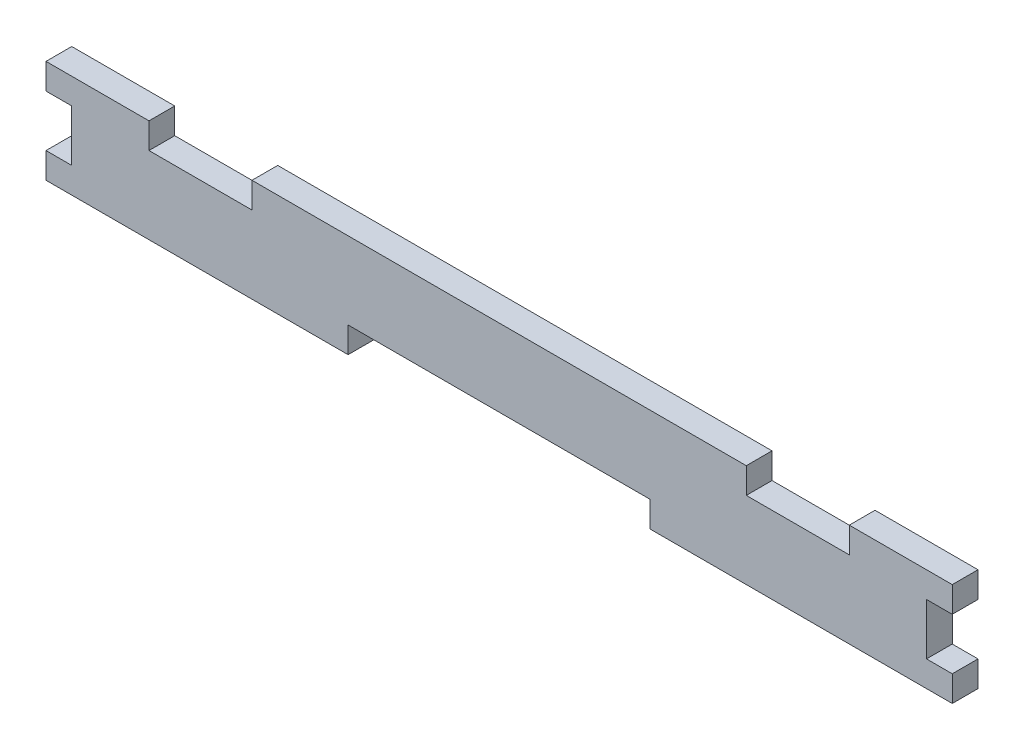
ISO-10303-21;
HEADER;
FILE_DESCRIPTION(('STEP AP214'),'2;1');
FILE_NAME('part.step','',(''),(''),'','','');
FILE_SCHEMA(('AUTOMOTIVE_DESIGN { 1 0 10303 214 1 1 1 1 }'));
ENDSEC;
DATA;
#1=APPLICATION_CONTEXT('core data for automotive mechanical design processes');
#2=APPLICATION_PROTOCOL_DEFINITION('international standard','automotive_design',2000,#1);
#3=PRODUCT_CONTEXT('',#1,'mechanical');
#4=PRODUCT('Part','Part','',(#3));
#5=PRODUCT_RELATED_PRODUCT_CATEGORY('part','',(#4));
#6=PRODUCT_DEFINITION_FORMATION('','',#4);
#7=PRODUCT_DEFINITION_CONTEXT('part definition',#1,'design');
#8=PRODUCT_DEFINITION('design','',#6,#7);
#9=PRODUCT_DEFINITION_SHAPE('','',#8);
#10=(LENGTH_UNIT() NAMED_UNIT(*) SI_UNIT(.MILLI.,.METRE.));
#11=(NAMED_UNIT(*) PLANE_ANGLE_UNIT() SI_UNIT($,.RADIAN.));
#12=(NAMED_UNIT(*) SI_UNIT($,.STERADIAN.) SOLID_ANGLE_UNIT());
#13=UNCERTAINTY_MEASURE_WITH_UNIT(LENGTH_MEASURE(1.E-05),#10,'distance_accuracy_value','');
#14=(GEOMETRIC_REPRESENTATION_CONTEXT(3) GLOBAL_UNCERTAINTY_ASSIGNED_CONTEXT((#13)) GLOBAL_UNIT_ASSIGNED_CONTEXT((#10,
#11,#12)) REPRESENTATION_CONTEXT('',''));
#15=CARTESIAN_POINT('',(0.,0.,0.));
#16=DIRECTION('',(0.,0.,1.));
#17=DIRECTION('',(1.,0.,0.));
#18=AXIS2_PLACEMENT_3D('',#15,#16,#17);
#19=CARTESIAN_POINT('',(0.,0.,5.));
#20=DIRECTION('',(1.,0.,0.));
#21=DIRECTION('',(0.,0.,-1.));
#22=AXIS2_PLACEMENT_3D('',#19,#20,#21);
#23=PLANE('',#22);
#24=DIRECTION('',(0.,-1.,0.));
#25=VECTOR('',#24,1.);
#26=CARTESIAN_POINT('',(0.,0.,0.));
#27=LINE('',#26,#25);
#28=CARTESIAN_POINT('',(0.,5.,0.));
#29=VERTEX_POINT('',#28);
#30=CARTESIAN_POINT('',(0.,0.,0.));
#31=VERTEX_POINT('',#30);
#32=EDGE_CURVE('E224',#29,#31,#27,.T.);
#33=ORIENTED_EDGE('',*,*,#32,.T.);
#34=DIRECTION('',(0.,0.,-1.));
#35=VECTOR('',#34,1.);
#36=CARTESIAN_POINT('',(0.,0.,5.));
#37=LINE('',#36,#35);
#38=CARTESIAN_POINT('',(0.,0.,5.));
#39=VERTEX_POINT('',#38);
#40=EDGE_CURVE('E11',#39,#31,#37,.T.);
#41=ORIENTED_EDGE('',*,*,#40,.F.);
#42=DIRECTION('',(0.,-1.,0.));
#43=VECTOR('',#42,1.);
#44=CARTESIAN_POINT('',(0.,0.,5.));
#45=LINE('',#44,#43);
#46=CARTESIAN_POINT('',(0.,5.,5.));
#47=VERTEX_POINT('',#46);
#48=EDGE_CURVE('E270',#47,#39,#45,.T.);
#49=ORIENTED_EDGE('',*,*,#48,.F.);
#50=DIRECTION('',(0.,0.,-1.));
#51=VECTOR('',#50,1.);
#52=CARTESIAN_POINT('',(0.,5.,5.));
#53=LINE('',#52,#51);
#54=EDGE_CURVE('E220',#47,#29,#53,.T.);
#55=ORIENTED_EDGE('',*,*,#54,.T.);
#56=EDGE_LOOP('',(#33,#41,#49,#55));
#57=FACE_BOUND('',#56,.T.);
#58=ADVANCED_FACE('F32',(#57),#23,.F.);
#59=CARTESIAN_POINT('',(0.,0.,5.));
#60=DIRECTION('',(0.,1.,0.));
#61=DIRECTION('',(0.,0.,1.));
#62=AXIS2_PLACEMENT_3D('',#59,#60,#61);
#63=PLANE('',#62);
#64=DIRECTION('',(1.,0.,0.));
#65=VECTOR('',#64,1.);
#66=CARTESIAN_POINT('',(0.,0.,0.));
#67=LINE('',#66,#65);
#68=CARTESIAN_POINT('',(58.6666666666667,0.,0.));
#69=VERTEX_POINT('',#68);
#70=EDGE_CURVE('E227',#31,#69,#67,.T.);
#71=ORIENTED_EDGE('',*,*,#70,.T.);
#72=DIRECTION('',(0.,0.,-1.));
#73=VECTOR('',#72,1.);
#74=CARTESIAN_POINT('',(58.6666666666667,0.,5.));
#75=LINE('',#74,#73);
#76=CARTESIAN_POINT('',(58.6666666666667,0.,5.));
#77=VERTEX_POINT('',#76);
#78=EDGE_CURVE('E40',#77,#69,#75,.T.);
#79=ORIENTED_EDGE('',*,*,#78,.F.);
#80=DIRECTION('',(1.,0.,0.));
#81=VECTOR('',#80,1.);
#82=CARTESIAN_POINT('',(0.,0.,5.));
#83=LINE('',#82,#81);
#84=EDGE_CURVE('E139',#39,#77,#83,.T.);
#85=ORIENTED_EDGE('',*,*,#84,.F.);
#86=ORIENTED_EDGE('',*,*,#40,.T.);
#87=EDGE_LOOP('',(#71,#79,#85,#86));
#88=FACE_BOUND('',#87,.T.);
#89=ADVANCED_FACE('F408',(#88),#63,.F.);
#90=CARTESIAN_POINT('',(58.6666666666667,0.,5.));
#91=DIRECTION('',(-1.,0.,0.));
#92=DIRECTION('',(0.,0.,1.));
#93=AXIS2_PLACEMENT_3D('',#90,#91,#92);
#94=PLANE('',#93);
#95=DIRECTION('',(0.,1.,0.));
#96=VECTOR('',#95,1.);
#97=CARTESIAN_POINT('',(58.6666666666667,0.,0.));
#98=LINE('',#97,#96);
#99=CARTESIAN_POINT('',(58.6666666666667,5.,0.));
#100=VERTEX_POINT('',#99);
#101=EDGE_CURVE('E229',#69,#100,#98,.T.);
#102=ORIENTED_EDGE('',*,*,#101,.T.);
#103=DIRECTION('',(0.,0.,-1.));
#104=VECTOR('',#103,1.);
#105=CARTESIAN_POINT('',(58.6666666666667,5.,5.));
#106=LINE('',#105,#104);
#107=CARTESIAN_POINT('',(58.6666666666667,5.,5.));
#108=VERTEX_POINT('',#107);
#109=EDGE_CURVE('E325',#108,#100,#106,.T.);
#110=ORIENTED_EDGE('',*,*,#109,.F.);
#111=DIRECTION('',(0.,1.,0.));
#112=VECTOR('',#111,1.);
#113=CARTESIAN_POINT('',(58.6666666666667,0.,5.));
#114=LINE('',#113,#112);
#115=EDGE_CURVE('E333',#77,#108,#114,.T.);
#116=ORIENTED_EDGE('',*,*,#115,.F.);
#117=ORIENTED_EDGE('',*,*,#78,.T.);
#118=EDGE_LOOP('',(#102,#110,#116,#117));
#119=FACE_BOUND('',#118,.T.);
#120=ADVANCED_FACE('F331',(#119),#94,.F.);
#121=CARTESIAN_POINT('',(58.6666666666667,5.,5.));
#122=DIRECTION('',(0.,1.,0.));
#123=DIRECTION('',(0.,0.,1.));
#124=AXIS2_PLACEMENT_3D('',#121,#122,#123);
#125=PLANE('',#124);
#126=DIRECTION('',(1.,0.,0.));
#127=VECTOR('',#126,1.);
#128=CARTESIAN_POINT('',(58.6666666666667,5.,0.));
#129=LINE('',#128,#127);
#130=CARTESIAN_POINT('',(117.333333333333,5.,0.));
#131=VERTEX_POINT('',#130);
#132=EDGE_CURVE('E231',#100,#131,#129,.T.);
#133=ORIENTED_EDGE('',*,*,#132,.T.);
#134=DIRECTION('',(0.,0.,-1.));
#135=VECTOR('',#134,1.);
#136=CARTESIAN_POINT('',(117.333333333333,5.,5.));
#137=LINE('',#136,#135);
#138=CARTESIAN_POINT('',(117.333333333333,5.,5.));
#139=VERTEX_POINT('',#138);
#140=EDGE_CURVE('E322',#139,#131,#137,.T.);
#141=ORIENTED_EDGE('',*,*,#140,.F.);
#142=DIRECTION('',(1.,0.,0.));
#143=VECTOR('',#142,1.);
#144=CARTESIAN_POINT('',(58.6666666666667,5.,5.));
#145=LINE('',#144,#143);
#146=EDGE_CURVE('E351',#108,#139,#145,.T.);
#147=ORIENTED_EDGE('',*,*,#146,.F.);
#148=ORIENTED_EDGE('',*,*,#109,.T.);
#149=EDGE_LOOP('',(#133,#141,#147,#148));
#150=FACE_BOUND('',#149,.T.);
#151=ADVANCED_FACE('F342',(#150),#125,.F.);
#152=CARTESIAN_POINT('',(117.333333333333,0.,5.));
#153=DIRECTION('',(1.,0.,0.));
#154=DIRECTION('',(0.,0.,-1.));
#155=AXIS2_PLACEMENT_3D('',#152,#153,#154);
#156=PLANE('',#155);
#157=DIRECTION('',(0.,-1.,0.));
#158=VECTOR('',#157,1.);
#159=CARTESIAN_POINT('',(117.333333333333,0.,0.));
#160=LINE('',#159,#158);
#161=CARTESIAN_POINT('',(117.333333333333,0.,0.));
#162=VERTEX_POINT('',#161);
#163=EDGE_CURVE('E233',#131,#162,#160,.T.);
#164=ORIENTED_EDGE('',*,*,#163,.T.);
#165=DIRECTION('',(0.,0.,-1.));
#166=VECTOR('',#165,1.);
#167=CARTESIAN_POINT('',(117.333333333333,0.,5.));
#168=LINE('',#167,#166);
#169=CARTESIAN_POINT('',(117.333333333333,0.,5.));
#170=VERTEX_POINT('',#169);
#171=EDGE_CURVE('E319',#170,#162,#168,.T.);
#172=ORIENTED_EDGE('',*,*,#171,.F.);
#173=DIRECTION('',(0.,-1.,0.));
#174=VECTOR('',#173,1.);
#175=CARTESIAN_POINT('',(117.333333333333,0.,5.));
#176=LINE('',#175,#174);
#177=EDGE_CURVE('E348',#139,#170,#176,.T.);
#178=ORIENTED_EDGE('',*,*,#177,.F.);
#179=ORIENTED_EDGE('',*,*,#140,.T.);
#180=EDGE_LOOP('',(#164,#172,#178,#179));
#181=FACE_BOUND('',#180,.T.);
#182=ADVANCED_FACE('F346',(#181),#156,.F.);
#183=CARTESIAN_POINT('',(117.333333333333,0.,5.));
#184=DIRECTION('',(0.,1.,0.));
#185=DIRECTION('',(0.,0.,1.));
#186=AXIS2_PLACEMENT_3D('',#183,#184,#185);
#187=PLANE('',#186);
#188=DIRECTION('',(1.,0.,0.));
#189=VECTOR('',#188,1.);
#190=CARTESIAN_POINT('',(117.333333333333,0.,0.));
#191=LINE('',#190,#189);
#192=CARTESIAN_POINT('',(176.,0.,0.));
#193=VERTEX_POINT('',#192);
#194=EDGE_CURVE('E235',#162,#193,#191,.T.);
#195=ORIENTED_EDGE('',*,*,#194,.T.);
#196=DIRECTION('',(0.,0.,-1.));
#197=VECTOR('',#196,1.);
#198=CARTESIAN_POINT('',(176.,0.,5.));
#199=LINE('',#198,#197);
#200=CARTESIAN_POINT('',(176.,0.,5.));
#201=VERTEX_POINT('',#200);
#202=EDGE_CURVE('E316',#201,#193,#199,.T.);
#203=ORIENTED_EDGE('',*,*,#202,.F.);
#204=DIRECTION('',(1.,0.,0.));
#205=VECTOR('',#204,1.);
#206=CARTESIAN_POINT('',(117.333333333333,0.,5.));
#207=LINE('',#206,#205);
#208=EDGE_CURVE('E350',#170,#201,#207,.T.);
#209=ORIENTED_EDGE('',*,*,#208,.F.);
#210=ORIENTED_EDGE('',*,*,#171,.T.);
#211=EDGE_LOOP('',(#195,#203,#209,#210));
#212=FACE_BOUND('',#211,.T.);
#213=ADVANCED_FACE('F421',(#212),#187,.F.);
#214=CARTESIAN_POINT('',(176.,0.,5.));
#215=DIRECTION('',(-1.,0.,0.));
#216=DIRECTION('',(0.,0.,1.));
#217=AXIS2_PLACEMENT_3D('',#214,#215,#216);
#218=PLANE('',#217);
#219=DIRECTION('',(0.,1.,0.));
#220=VECTOR('',#219,1.);
#221=CARTESIAN_POINT('',(176.,0.,0.));
#222=LINE('',#221,#220);
#223=CARTESIAN_POINT('',(176.,5.,0.));
#224=VERTEX_POINT('',#223);
#225=EDGE_CURVE('E237',#193,#224,#222,.T.);
#226=ORIENTED_EDGE('',*,*,#225,.T.);
#227=DIRECTION('',(0.,0.,-1.));
#228=VECTOR('',#227,1.);
#229=CARTESIAN_POINT('',(176.,5.,5.));
#230=LINE('',#229,#228);
#231=CARTESIAN_POINT('',(176.,5.,5.));
#232=VERTEX_POINT('',#231);
#233=EDGE_CURVE('E313',#232,#224,#230,.T.);
#234=ORIENTED_EDGE('',*,*,#233,.F.);
#235=DIRECTION('',(0.,1.,0.));
#236=VECTOR('',#235,1.);
#237=CARTESIAN_POINT('',(176.,0.,5.));
#238=LINE('',#237,#236);
#239=EDGE_CURVE('E353',#201,#232,#238,.T.);
#240=ORIENTED_EDGE('',*,*,#239,.F.);
#241=ORIENTED_EDGE('',*,*,#202,.T.);
#242=EDGE_LOOP('',(#226,#234,#240,#241));
#243=FACE_BOUND('',#242,.T.);
#244=ADVANCED_FACE('F424',(#243),#218,.F.);
#245=CARTESIAN_POINT('',(176.,5.,5.));
#246=DIRECTION('',(0.,-1.,0.));
#247=DIRECTION('',(1.,0.,0.));
#248=AXIS2_PLACEMENT_3D('',#245,#246,#247);
#249=PLANE('',#248);
#250=DIRECTION('',(-1.,0.,0.));
#251=VECTOR('',#250,1.);
#252=CARTESIAN_POINT('',(176.,5.,0.));
#253=LINE('',#252,#251);
#254=CARTESIAN_POINT('',(171.,4.99999999999999,0.));
#255=VERTEX_POINT('',#254);
#256=EDGE_CURVE('E239',#224,#255,#253,.T.);
#257=ORIENTED_EDGE('',*,*,#256,.T.);
#258=DIRECTION('',(0.,0.,-1.));
#259=VECTOR('',#258,1.);
#260=CARTESIAN_POINT('',(171.,4.99999999999999,5.));
#261=LINE('',#260,#259);
#262=CARTESIAN_POINT('',(171.,4.99999999999999,5.));
#263=VERTEX_POINT('',#262);
#264=EDGE_CURVE('E310',#263,#255,#261,.T.);
#265=ORIENTED_EDGE('',*,*,#264,.F.);
#266=DIRECTION('',(-1.,0.,0.));
#267=VECTOR('',#266,1.);
#268=CARTESIAN_POINT('',(176.,5.,5.));
#269=LINE('',#268,#267);
#270=EDGE_CURVE('E359',#232,#263,#269,.T.);
#271=ORIENTED_EDGE('',*,*,#270,.F.);
#272=ORIENTED_EDGE('',*,*,#233,.T.);
#273=EDGE_LOOP('',(#257,#265,#271,#272));
#274=FACE_BOUND('',#273,.T.);
#275=ADVANCED_FACE('F428',(#274),#249,.F.);
#276=CARTESIAN_POINT('',(171.,15.,5.));
#277=DIRECTION('',(-1.,0.,0.));
#278=DIRECTION('',(0.,0.,1.));
#279=AXIS2_PLACEMENT_3D('',#276,#277,#278);
#280=PLANE('',#279);
#281=DIRECTION('',(0.,1.,0.));
#282=VECTOR('',#281,1.);
#283=CARTESIAN_POINT('',(171.,15.,0.));
#284=LINE('',#283,#282);
#285=CARTESIAN_POINT('',(171.,15.,0.));
#286=VERTEX_POINT('',#285);
#287=EDGE_CURVE('E241',#255,#286,#284,.T.);
#288=ORIENTED_EDGE('',*,*,#287,.T.);
#289=DIRECTION('',(0.,0.,-1.));
#290=VECTOR('',#289,1.);
#291=CARTESIAN_POINT('',(171.,15.,5.));
#292=LINE('',#291,#290);
#293=CARTESIAN_POINT('',(171.,15.,5.));
#294=VERTEX_POINT('',#293);
#295=EDGE_CURVE('E307',#294,#286,#292,.T.);
#296=ORIENTED_EDGE('',*,*,#295,.F.);
#297=DIRECTION('',(0.,1.,0.));
#298=VECTOR('',#297,1.);
#299=CARTESIAN_POINT('',(171.,15.,5.));
#300=LINE('',#299,#298);
#301=EDGE_CURVE('E361',#263,#294,#300,.T.);
#302=ORIENTED_EDGE('',*,*,#301,.F.);
#303=ORIENTED_EDGE('',*,*,#264,.T.);
#304=EDGE_LOOP('',(#288,#296,#302,#303));
#305=FACE_BOUND('',#304,.T.);
#306=ADVANCED_FACE('F432',(#305),#280,.F.);
#307=CARTESIAN_POINT('',(176.,15.,5.));
#308=DIRECTION('',(0.,1.,0.));
#309=DIRECTION('',(0.,0.,1.));
#310=AXIS2_PLACEMENT_3D('',#307,#308,#309);
#311=PLANE('',#310);
#312=DIRECTION('',(1.,0.,0.));
#313=VECTOR('',#312,1.);
#314=CARTESIAN_POINT('',(176.,15.,0.));
#315=LINE('',#314,#313);
#316=CARTESIAN_POINT('',(176.,15.,0.));
#317=VERTEX_POINT('',#316);
#318=EDGE_CURVE('E243',#286,#317,#315,.T.);
#319=ORIENTED_EDGE('',*,*,#318,.T.);
#320=DIRECTION('',(0.,0.,-1.));
#321=VECTOR('',#320,1.);
#322=CARTESIAN_POINT('',(176.,15.,5.));
#323=LINE('',#322,#321);
#324=CARTESIAN_POINT('',(176.,15.,5.));
#325=VERTEX_POINT('',#324);
#326=EDGE_CURVE('E304',#325,#317,#323,.T.);
#327=ORIENTED_EDGE('',*,*,#326,.F.);
#328=DIRECTION('',(1.,0.,0.));
#329=VECTOR('',#328,1.);
#330=CARTESIAN_POINT('',(176.,15.,5.));
#331=LINE('',#330,#329);
#332=EDGE_CURVE('E363',#294,#325,#331,.T.);
#333=ORIENTED_EDGE('',*,*,#332,.F.);
#334=ORIENTED_EDGE('',*,*,#295,.T.);
#335=EDGE_LOOP('',(#319,#327,#333,#334));
#336=FACE_BOUND('',#335,.T.);
#337=ADVANCED_FACE('F436',(#336),#311,.F.);
#338=CARTESIAN_POINT('',(176.,15.,5.));
#339=DIRECTION('',(-1.,0.,0.));
#340=DIRECTION('',(0.,0.,1.));
#341=AXIS2_PLACEMENT_3D('',#338,#339,#340);
#342=PLANE('',#341);
#343=DIRECTION('',(0.,1.,0.));
#344=VECTOR('',#343,1.);
#345=CARTESIAN_POINT('',(176.,15.,0.));
#346=LINE('',#345,#344);
#347=CARTESIAN_POINT('',(176.,20.,0.));
#348=VERTEX_POINT('',#347);
#349=EDGE_CURVE('E245',#317,#348,#346,.T.);
#350=ORIENTED_EDGE('',*,*,#349,.T.);
#351=DIRECTION('',(0.,0.,-1.));
#352=VECTOR('',#351,1.);
#353=CARTESIAN_POINT('',(176.,20.,5.));
#354=LINE('',#353,#352);
#355=CARTESIAN_POINT('',(176.,20.,5.));
#356=VERTEX_POINT('',#355);
#357=EDGE_CURVE('E301',#356,#348,#354,.T.);
#358=ORIENTED_EDGE('',*,*,#357,.F.);
#359=DIRECTION('',(0.,1.,0.));
#360=VECTOR('',#359,1.);
#361=CARTESIAN_POINT('',(176.,15.,5.));
#362=LINE('',#361,#360);
#363=EDGE_CURVE('E365',#325,#356,#362,.T.);
#364=ORIENTED_EDGE('',*,*,#363,.F.);
#365=ORIENTED_EDGE('',*,*,#326,.T.);
#366=EDGE_LOOP('',(#350,#358,#364,#365));
#367=FACE_BOUND('',#366,.T.);
#368=ADVANCED_FACE('F440',(#367),#342,.F.);
#369=CARTESIAN_POINT('',(156.,20.,5.));
#370=DIRECTION('',(0.,-1.,0.));
#371=DIRECTION('',(0.,0.,-1.));
#372=AXIS2_PLACEMENT_3D('',#369,#370,#371);
#373=PLANE('',#372);
#374=DIRECTION('',(-1.,0.,0.));
#375=VECTOR('',#374,1.);
#376=CARTESIAN_POINT('',(156.,20.,0.));
#377=LINE('',#376,#375);
#378=CARTESIAN_POINT('',(156.,20.,0.));
#379=VERTEX_POINT('',#378);
#380=EDGE_CURVE('E247',#348,#379,#377,.T.);
#381=ORIENTED_EDGE('',*,*,#380,.T.);
#382=DIRECTION('',(0.,0.,-1.));
#383=VECTOR('',#382,1.);
#384=CARTESIAN_POINT('',(156.,20.,5.));
#385=LINE('',#384,#383);
#386=CARTESIAN_POINT('',(156.,20.,5.));
#387=VERTEX_POINT('',#386);
#388=EDGE_CURVE('E298',#387,#379,#385,.T.);
#389=ORIENTED_EDGE('',*,*,#388,.F.);
#390=DIRECTION('',(-1.,0.,0.));
#391=VECTOR('',#390,1.);
#392=CARTESIAN_POINT('',(156.,20.,5.));
#393=LINE('',#392,#391);
#394=EDGE_CURVE('E367',#356,#387,#393,.T.);
#395=ORIENTED_EDGE('',*,*,#394,.F.);
#396=ORIENTED_EDGE('',*,*,#357,.T.);
#397=EDGE_LOOP('',(#381,#389,#395,#396));
#398=FACE_BOUND('',#397,.T.);
#399=ADVANCED_FACE('F444',(#398),#373,.F.);
#400=CARTESIAN_POINT('',(156.,20.,5.));
#401=DIRECTION('',(1.,0.,0.));
#402=DIRECTION('',(0.,0.,-1.));
#403=AXIS2_PLACEMENT_3D('',#400,#401,#402);
#404=PLANE('',#403);
#405=DIRECTION('',(0.,-1.,0.));
#406=VECTOR('',#405,1.);
#407=CARTESIAN_POINT('',(156.,20.,0.));
#408=LINE('',#407,#406);
#409=CARTESIAN_POINT('',(156.,15.,0.));
#410=VERTEX_POINT('',#409);
#411=EDGE_CURVE('E249',#379,#410,#408,.T.);
#412=ORIENTED_EDGE('',*,*,#411,.T.);
#413=DIRECTION('',(0.,0.,-1.));
#414=VECTOR('',#413,1.);
#415=CARTESIAN_POINT('',(156.,15.,5.));
#416=LINE('',#415,#414);
#417=CARTESIAN_POINT('',(156.,15.,5.));
#418=VERTEX_POINT('',#417);
#419=EDGE_CURVE('E295',#418,#410,#416,.T.);
#420=ORIENTED_EDGE('',*,*,#419,.F.);
#421=DIRECTION('',(0.,-1.,0.));
#422=VECTOR('',#421,1.);
#423=CARTESIAN_POINT('',(156.,20.,5.));
#424=LINE('',#423,#422);
#425=EDGE_CURVE('E369',#387,#418,#424,.T.);
#426=ORIENTED_EDGE('',*,*,#425,.F.);
#427=ORIENTED_EDGE('',*,*,#388,.T.);
#428=EDGE_LOOP('',(#412,#420,#426,#427));
#429=FACE_BOUND('',#428,.T.);
#430=ADVANCED_FACE('F448',(#429),#404,.F.);
#431=CARTESIAN_POINT('',(156.,15.,5.));
#432=DIRECTION('',(0.,-1.,0.));
#433=DIRECTION('',(1.,0.,0.));
#434=AXIS2_PLACEMENT_3D('',#431,#432,#433);
#435=PLANE('',#434);
#436=DIRECTION('',(-1.,0.,0.));
#437=VECTOR('',#436,1.);
#438=CARTESIAN_POINT('',(156.,15.,0.));
#439=LINE('',#438,#437);
#440=CARTESIAN_POINT('',(136.,15.,0.));
#441=VERTEX_POINT('',#440);
#442=EDGE_CURVE('E251',#410,#441,#439,.T.);
#443=ORIENTED_EDGE('',*,*,#442,.T.);
#444=DIRECTION('',(0.,0.,-1.));
#445=VECTOR('',#444,1.);
#446=CARTESIAN_POINT('',(136.,15.,5.));
#447=LINE('',#446,#445);
#448=CARTESIAN_POINT('',(136.,15.,5.));
#449=VERTEX_POINT('',#448);
#450=EDGE_CURVE('E292',#449,#441,#447,.T.);
#451=ORIENTED_EDGE('',*,*,#450,.F.);
#452=DIRECTION('',(-1.,0.,0.));
#453=VECTOR('',#452,1.);
#454=CARTESIAN_POINT('',(156.,15.,5.));
#455=LINE('',#454,#453);
#456=EDGE_CURVE('E371',#418,#449,#455,.T.);
#457=ORIENTED_EDGE('',*,*,#456,.F.);
#458=ORIENTED_EDGE('',*,*,#419,.T.);
#459=EDGE_LOOP('',(#443,#451,#457,#458));
#460=FACE_BOUND('',#459,.T.);
#461=ADVANCED_FACE('F452',(#460),#435,.F.);
#462=CARTESIAN_POINT('',(136.,20.,5.));
#463=DIRECTION('',(-1.,0.,0.));
#464=DIRECTION('',(0.,0.,1.));
#465=AXIS2_PLACEMENT_3D('',#462,#463,#464);
#466=PLANE('',#465);
#467=DIRECTION('',(0.,1.,0.));
#468=VECTOR('',#467,1.);
#469=CARTESIAN_POINT('',(136.,20.,0.));
#470=LINE('',#469,#468);
#471=CARTESIAN_POINT('',(136.,20.,0.));
#472=VERTEX_POINT('',#471);
#473=EDGE_CURVE('E253',#441,#472,#470,.T.);
#474=ORIENTED_EDGE('',*,*,#473,.T.);
#475=DIRECTION('',(0.,0.,-1.));
#476=VECTOR('',#475,1.);
#477=CARTESIAN_POINT('',(136.,20.,5.));
#478=LINE('',#477,#476);
#479=CARTESIAN_POINT('',(136.,20.,5.));
#480=VERTEX_POINT('',#479);
#481=EDGE_CURVE('E289',#480,#472,#478,.T.);
#482=ORIENTED_EDGE('',*,*,#481,.F.);
#483=DIRECTION('',(0.,1.,0.));
#484=VECTOR('',#483,1.);
#485=CARTESIAN_POINT('',(136.,20.,5.));
#486=LINE('',#485,#484);
#487=EDGE_CURVE('E373',#449,#480,#486,.T.);
#488=ORIENTED_EDGE('',*,*,#487,.F.);
#489=ORIENTED_EDGE('',*,*,#450,.T.);
#490=EDGE_LOOP('',(#474,#482,#488,#489));
#491=FACE_BOUND('',#490,.T.);
#492=ADVANCED_FACE('F456',(#491),#466,.F.);
#493=CARTESIAN_POINT('',(40.,20.,5.));
#494=DIRECTION('',(0.,-1.,0.));
#495=DIRECTION('',(1.,0.,0.));
#496=AXIS2_PLACEMENT_3D('',#493,#494,#495);
#497=PLANE('',#496);
#498=DIRECTION('',(-1.,0.,0.));
#499=VECTOR('',#498,1.);
#500=CARTESIAN_POINT('',(40.,20.,0.));
#501=LINE('',#500,#499);
#502=CARTESIAN_POINT('',(40.,20.,0.));
#503=VERTEX_POINT('',#502);
#504=EDGE_CURVE('E255',#472,#503,#501,.T.);
#505=ORIENTED_EDGE('',*,*,#504,.T.);
#506=DIRECTION('',(0.,0.,-1.));
#507=VECTOR('',#506,1.);
#508=CARTESIAN_POINT('',(40.,20.,5.));
#509=LINE('',#508,#507);
#510=CARTESIAN_POINT('',(40.,20.,5.));
#511=VERTEX_POINT('',#510);
#512=EDGE_CURVE('E286',#511,#503,#509,.T.);
#513=ORIENTED_EDGE('',*,*,#512,.F.);
#514=DIRECTION('',(-1.,0.,0.));
#515=VECTOR('',#514,1.);
#516=CARTESIAN_POINT('',(40.,20.,5.));
#517=LINE('',#516,#515);
#518=EDGE_CURVE('E375',#480,#511,#517,.T.);
#519=ORIENTED_EDGE('',*,*,#518,.F.);
#520=ORIENTED_EDGE('',*,*,#481,.T.);
#521=EDGE_LOOP('',(#505,#513,#519,#520));
#522=FACE_BOUND('',#521,.T.);
#523=ADVANCED_FACE('F460',(#522),#497,.F.);
#524=CARTESIAN_POINT('',(40.,20.,5.));
#525=DIRECTION('',(1.,0.,0.));
#526=DIRECTION('',(0.,1.,0.));
#527=AXIS2_PLACEMENT_3D('',#524,#525,#526);
#528=PLANE('',#527);
#529=DIRECTION('',(0.,-1.,0.));
#530=VECTOR('',#529,1.);
#531=CARTESIAN_POINT('',(40.,20.,0.));
#532=LINE('',#531,#530);
#533=CARTESIAN_POINT('',(40.,15.,0.));
#534=VERTEX_POINT('',#533);
#535=EDGE_CURVE('E257',#503,#534,#532,.T.);
#536=ORIENTED_EDGE('',*,*,#535,.T.);
#537=DIRECTION('',(0.,0.,-1.));
#538=VECTOR('',#537,1.);
#539=CARTESIAN_POINT('',(40.,15.,5.));
#540=LINE('',#539,#538);
#541=CARTESIAN_POINT('',(40.,15.,5.));
#542=VERTEX_POINT('',#541);
#543=EDGE_CURVE('E283',#542,#534,#540,.T.);
#544=ORIENTED_EDGE('',*,*,#543,.F.);
#545=DIRECTION('',(0.,-1.,0.));
#546=VECTOR('',#545,1.);
#547=CARTESIAN_POINT('',(40.,20.,5.));
#548=LINE('',#547,#546);
#549=EDGE_CURVE('E377',#511,#542,#548,.T.);
#550=ORIENTED_EDGE('',*,*,#549,.F.);
#551=ORIENTED_EDGE('',*,*,#512,.T.);
#552=EDGE_LOOP('',(#536,#544,#550,#551));
#553=FACE_BOUND('',#552,.T.);
#554=ADVANCED_FACE('F464',(#553),#528,.F.);
#555=CARTESIAN_POINT('',(20.,15.,5.));
#556=DIRECTION('',(0.,-1.,0.));
#557=DIRECTION('',(0.,0.,-1.));
#558=AXIS2_PLACEMENT_3D('',#555,#556,#557);
#559=PLANE('',#558);
#560=DIRECTION('',(-1.,0.,0.));
#561=VECTOR('',#560,1.);
#562=CARTESIAN_POINT('',(20.,15.,0.));
#563=LINE('',#562,#561);
#564=CARTESIAN_POINT('',(20.,15.,0.));
#565=VERTEX_POINT('',#564);
#566=EDGE_CURVE('E259',#534,#565,#563,.T.);
#567=ORIENTED_EDGE('',*,*,#566,.T.);
#568=DIRECTION('',(0.,0.,-1.));
#569=VECTOR('',#568,1.);
#570=CARTESIAN_POINT('',(20.,15.,5.));
#571=LINE('',#570,#569);
#572=CARTESIAN_POINT('',(20.,15.,5.));
#573=VERTEX_POINT('',#572);
#574=EDGE_CURVE('E280',#573,#565,#571,.T.);
#575=ORIENTED_EDGE('',*,*,#574,.F.);
#576=DIRECTION('',(-1.,0.,0.));
#577=VECTOR('',#576,1.);
#578=CARTESIAN_POINT('',(20.,15.,5.));
#579=LINE('',#578,#577);
#580=EDGE_CURVE('E379',#542,#573,#579,.T.);
#581=ORIENTED_EDGE('',*,*,#580,.F.);
#582=ORIENTED_EDGE('',*,*,#543,.T.);
#583=EDGE_LOOP('',(#567,#575,#581,#582));
#584=FACE_BOUND('',#583,.T.);
#585=ADVANCED_FACE('F468',(#584),#559,.F.);
#586=CARTESIAN_POINT('',(20.,20.,5.));
#587=DIRECTION('',(-1.,0.,0.));
#588=DIRECTION('',(0.,-1.,0.));
#589=AXIS2_PLACEMENT_3D('',#586,#587,#588);
#590=PLANE('',#589);
#591=DIRECTION('',(0.,1.,0.));
#592=VECTOR('',#591,1.);
#593=CARTESIAN_POINT('',(20.,20.,0.));
#594=LINE('',#593,#592);
#595=CARTESIAN_POINT('',(20.,20.,0.));
#596=VERTEX_POINT('',#595);
#597=EDGE_CURVE('E261',#565,#596,#594,.T.);
#598=ORIENTED_EDGE('',*,*,#597,.T.);
#599=DIRECTION('',(0.,0.,-1.));
#600=VECTOR('',#599,1.);
#601=CARTESIAN_POINT('',(20.,20.,5.));
#602=LINE('',#601,#600);
#603=CARTESIAN_POINT('',(20.,20.,5.));
#604=VERTEX_POINT('',#603);
#605=EDGE_CURVE('E277',#604,#596,#602,.T.);
#606=ORIENTED_EDGE('',*,*,#605,.F.);
#607=DIRECTION('',(0.,1.,0.));
#608=VECTOR('',#607,1.);
#609=CARTESIAN_POINT('',(20.,20.,5.));
#610=LINE('',#609,#608);
#611=EDGE_CURVE('E381',#573,#604,#610,.T.);
#612=ORIENTED_EDGE('',*,*,#611,.F.);
#613=ORIENTED_EDGE('',*,*,#574,.T.);
#614=EDGE_LOOP('',(#598,#606,#612,#613));
#615=FACE_BOUND('',#614,.T.);
#616=ADVANCED_FACE('F472',(#615),#590,.F.);
#617=CARTESIAN_POINT('',(0.,20.,5.));
#618=DIRECTION('',(0.,-1.,0.));
#619=DIRECTION('',(0.,0.,-1.));
#620=AXIS2_PLACEMENT_3D('',#617,#618,#619);
#621=PLANE('',#620);
#622=DIRECTION('',(-1.,0.,0.));
#623=VECTOR('',#622,1.);
#624=CARTESIAN_POINT('',(0.,20.,0.));
#625=LINE('',#624,#623);
#626=CARTESIAN_POINT('',(0.,20.,0.));
#627=VERTEX_POINT('',#626);
#628=EDGE_CURVE('E263',#596,#627,#625,.T.);
#629=ORIENTED_EDGE('',*,*,#628,.T.);
#630=DIRECTION('',(0.,0.,-1.));
#631=VECTOR('',#630,1.);
#632=CARTESIAN_POINT('',(0.,20.,5.));
#633=LINE('',#632,#631);
#634=CARTESIAN_POINT('',(0.,20.,5.));
#635=VERTEX_POINT('',#634);
#636=EDGE_CURVE('E274',#635,#627,#633,.T.);
#637=ORIENTED_EDGE('',*,*,#636,.F.);
#638=DIRECTION('',(-1.,0.,0.));
#639=VECTOR('',#638,1.);
#640=CARTESIAN_POINT('',(0.,20.,5.));
#641=LINE('',#640,#639);
#642=EDGE_CURVE('E383',#604,#635,#641,.T.);
#643=ORIENTED_EDGE('',*,*,#642,.F.);
#644=ORIENTED_EDGE('',*,*,#605,.T.);
#645=EDGE_LOOP('',(#629,#637,#643,#644));
#646=FACE_BOUND('',#645,.T.);
#647=ADVANCED_FACE('F389',(#646),#621,.F.);
#648=CARTESIAN_POINT('',(0.,15.,5.));
#649=DIRECTION('',(1.,0.,0.));
#650=DIRECTION('',(0.,1.,0.));
#651=AXIS2_PLACEMENT_3D('',#648,#649,#650);
#652=PLANE('',#651);
#653=DIRECTION('',(0.,-1.,0.));
#654=VECTOR('',#653,1.);
#655=CARTESIAN_POINT('',(0.,15.,0.));
#656=LINE('',#655,#654);
#657=CARTESIAN_POINT('',(0.,15.,0.));
#658=VERTEX_POINT('',#657);
#659=EDGE_CURVE('E265',#627,#658,#656,.T.);
#660=ORIENTED_EDGE('',*,*,#659,.T.);
#661=DIRECTION('',(0.,0.,-1.));
#662=VECTOR('',#661,1.);
#663=CARTESIAN_POINT('',(0.,15.,5.));
#664=LINE('',#663,#662);
#665=CARTESIAN_POINT('',(0.,15.,5.));
#666=VERTEX_POINT('',#665);
#667=EDGE_CURVE('E215',#666,#658,#664,.T.);
#668=ORIENTED_EDGE('',*,*,#667,.F.);
#669=DIRECTION('',(0.,-1.,0.));
#670=VECTOR('',#669,1.);
#671=CARTESIAN_POINT('',(0.,15.,5.));
#672=LINE('',#671,#670);
#673=EDGE_CURVE('E206',#635,#666,#672,.T.);
#674=ORIENTED_EDGE('',*,*,#673,.F.);
#675=ORIENTED_EDGE('',*,*,#636,.T.);
#676=EDGE_LOOP('',(#660,#668,#674,#675));
#677=FACE_BOUND('',#676,.T.);
#678=ADVANCED_FACE('F393',(#677),#652,.F.);
#679=CARTESIAN_POINT('',(0.,15.,5.));
#680=DIRECTION('',(0.,1.,0.));
#681=DIRECTION('',(0.,0.,1.));
#682=AXIS2_PLACEMENT_3D('',#679,#680,#681);
#683=PLANE('',#682);
#684=DIRECTION('',(1.,0.,0.));
#685=VECTOR('',#684,1.);
#686=CARTESIAN_POINT('',(0.,15.,0.));
#687=LINE('',#686,#685);
#688=CARTESIAN_POINT('',(5.,15.,0.));
#689=VERTEX_POINT('',#688);
#690=EDGE_CURVE('E214',#658,#689,#687,.T.);
#691=ORIENTED_EDGE('',*,*,#690,.T.);
#692=DIRECTION('',(0.,0.,-1.));
#693=VECTOR('',#692,1.);
#694=CARTESIAN_POINT('',(5.,15.,5.));
#695=LINE('',#694,#693);
#696=CARTESIAN_POINT('',(5.,15.,5.));
#697=VERTEX_POINT('',#696);
#698=EDGE_CURVE('E211',#697,#689,#695,.T.);
#699=ORIENTED_EDGE('',*,*,#698,.F.);
#700=DIRECTION('',(1.,0.,0.));
#701=VECTOR('',#700,1.);
#702=CARTESIAN_POINT('',(0.,15.,5.));
#703=LINE('',#702,#701);
#704=EDGE_CURVE('E200',#666,#697,#703,.T.);
#705=ORIENTED_EDGE('',*,*,#704,.F.);
#706=ORIENTED_EDGE('',*,*,#667,.T.);
#707=EDGE_LOOP('',(#691,#699,#705,#706));
#708=FACE_BOUND('',#707,.T.);
#709=ADVANCED_FACE('F212',(#708),#683,.F.);
#710=CARTESIAN_POINT('',(5.,15.,5.));
#711=DIRECTION('',(1.,0.,0.));
#712=DIRECTION('',(0.,1.,0.));
#713=AXIS2_PLACEMENT_3D('',#710,#711,#712);
#714=PLANE('',#713);
#715=DIRECTION('',(0.,-1.,0.));
#716=VECTOR('',#715,1.);
#717=CARTESIAN_POINT('',(5.,15.,0.));
#718=LINE('',#717,#716);
#719=CARTESIAN_POINT('',(5.,4.99999999999999,0.));
#720=VERTEX_POINT('',#719);
#721=EDGE_CURVE('E125',#689,#720,#718,.T.);
#722=ORIENTED_EDGE('',*,*,#721,.T.);
#723=DIRECTION('',(0.,0.,-1.));
#724=VECTOR('',#723,1.);
#725=CARTESIAN_POINT('',(5.,4.99999999999999,5.));
#726=LINE('',#725,#724);
#727=CARTESIAN_POINT('',(5.,4.99999999999999,5.));
#728=VERTEX_POINT('',#727);
#729=EDGE_CURVE('E216',#728,#720,#726,.T.);
#730=ORIENTED_EDGE('',*,*,#729,.F.);
#731=DIRECTION('',(0.,-1.,0.));
#732=VECTOR('',#731,1.);
#733=CARTESIAN_POINT('',(5.,15.,5.));
#734=LINE('',#733,#732);
#735=EDGE_CURVE('E204',#697,#728,#734,.T.);
#736=ORIENTED_EDGE('',*,*,#735,.F.);
#737=ORIENTED_EDGE('',*,*,#698,.T.);
#738=EDGE_LOOP('',(#722,#730,#736,#737));
#739=FACE_BOUND('',#738,.T.);
#740=ADVANCED_FACE('F218',(#739),#714,.F.);
#741=CARTESIAN_POINT('',(0.,5.,5.));
#742=DIRECTION('',(0.,-1.,0.));
#743=DIRECTION('',(1.,0.,0.));
#744=AXIS2_PLACEMENT_3D('',#741,#742,#743);
#745=PLANE('',#744);
#746=DIRECTION('',(-1.,0.,0.));
#747=VECTOR('',#746,1.);
#748=CARTESIAN_POINT('',(0.,5.,0.));
#749=LINE('',#748,#747);
#750=EDGE_CURVE('E131',#720,#29,#749,.T.);
#751=ORIENTED_EDGE('',*,*,#750,.T.);
#752=ORIENTED_EDGE('',*,*,#54,.F.);
#753=DIRECTION('',(-1.,0.,0.));
#754=VECTOR('',#753,1.);
#755=CARTESIAN_POINT('',(0.,5.,5.));
#756=LINE('',#755,#754);
#757=EDGE_CURVE('E48',#728,#47,#756,.T.);
#758=ORIENTED_EDGE('',*,*,#757,.F.);
#759=ORIENTED_EDGE('',*,*,#729,.T.);
#760=EDGE_LOOP('',(#751,#752,#758,#759));
#761=FACE_BOUND('',#760,.T.);
#762=ADVANCED_FACE('F397',(#761),#745,.F.);
#763=CARTESIAN_POINT('',(0.,0.,5.));
#764=DIRECTION('',(0.,0.,-1.));
#765=DIRECTION('',(-1.,0.,0.));
#766=AXIS2_PLACEMENT_3D('',#763,#764,#765);
#767=PLANE('',#766);
#768=ORIENTED_EDGE('',*,*,#48,.T.);
#769=ORIENTED_EDGE('',*,*,#84,.T.);
#770=ORIENTED_EDGE('',*,*,#115,.T.);
#771=ORIENTED_EDGE('',*,*,#146,.T.);
#772=ORIENTED_EDGE('',*,*,#177,.T.);
#773=ORIENTED_EDGE('',*,*,#208,.T.);
#774=ORIENTED_EDGE('',*,*,#239,.T.);
#775=ORIENTED_EDGE('',*,*,#270,.T.);
#776=ORIENTED_EDGE('',*,*,#301,.T.);
#777=ORIENTED_EDGE('',*,*,#332,.T.);
#778=ORIENTED_EDGE('',*,*,#363,.T.);
#779=ORIENTED_EDGE('',*,*,#394,.T.);
#780=ORIENTED_EDGE('',*,*,#425,.T.);
#781=ORIENTED_EDGE('',*,*,#456,.T.);
#782=ORIENTED_EDGE('',*,*,#487,.T.);
#783=ORIENTED_EDGE('',*,*,#518,.T.);
#784=ORIENTED_EDGE('',*,*,#549,.T.);
#785=ORIENTED_EDGE('',*,*,#580,.T.);
#786=ORIENTED_EDGE('',*,*,#611,.T.);
#787=ORIENTED_EDGE('',*,*,#642,.T.);
#788=ORIENTED_EDGE('',*,*,#673,.T.);
#789=ORIENTED_EDGE('',*,*,#704,.T.);
#790=ORIENTED_EDGE('',*,*,#735,.T.);
#791=ORIENTED_EDGE('',*,*,#757,.T.);
#792=EDGE_LOOP('',(#768,#769,#770,#771,#772,#773,#774,#775,#776,#777,#778,#779,#780,#781,#782,
#783,#784,#785,#786,#787,#788,#789,#790,#791));
#793=FACE_BOUND('',#792,.T.);
#794=ADVANCED_FACE('F202',(#793),#767,.F.);
#795=CARTESIAN_POINT('',(0.,0.,0.));
#796=DIRECTION('',(0.,0.,-1.));
#797=DIRECTION('',(-1.,0.,0.));
#798=AXIS2_PLACEMENT_3D('',#795,#796,#797);
#799=PLANE('',#798);
#800=ORIENTED_EDGE('',*,*,#32,.F.);
#801=ORIENTED_EDGE('',*,*,#750,.F.);
#802=ORIENTED_EDGE('',*,*,#721,.F.);
#803=ORIENTED_EDGE('',*,*,#690,.F.);
#804=ORIENTED_EDGE('',*,*,#659,.F.);
#805=ORIENTED_EDGE('',*,*,#628,.F.);
#806=ORIENTED_EDGE('',*,*,#597,.F.);
#807=ORIENTED_EDGE('',*,*,#566,.F.);
#808=ORIENTED_EDGE('',*,*,#535,.F.);
#809=ORIENTED_EDGE('',*,*,#504,.F.);
#810=ORIENTED_EDGE('',*,*,#473,.F.);
#811=ORIENTED_EDGE('',*,*,#442,.F.);
#812=ORIENTED_EDGE('',*,*,#411,.F.);
#813=ORIENTED_EDGE('',*,*,#380,.F.);
#814=ORIENTED_EDGE('',*,*,#349,.F.);
#815=ORIENTED_EDGE('',*,*,#318,.F.);
#816=ORIENTED_EDGE('',*,*,#287,.F.);
#817=ORIENTED_EDGE('',*,*,#256,.F.);
#818=ORIENTED_EDGE('',*,*,#225,.F.);
#819=ORIENTED_EDGE('',*,*,#194,.F.);
#820=ORIENTED_EDGE('',*,*,#163,.F.);
#821=ORIENTED_EDGE('',*,*,#132,.F.);
#822=ORIENTED_EDGE('',*,*,#101,.F.);
#823=ORIENTED_EDGE('',*,*,#70,.F.);
#824=EDGE_LOOP('',(#800,#801,#802,#803,#804,#805,#806,#807,#808,#809,#810,#811,#812,#813,#814,
#815,#816,#817,#818,#819,#820,#821,#822,#823));
#825=FACE_BOUND('',#824,.T.);
#826=ADVANCED_FACE('F337',(#825),#799,.T.);
#827=CLOSED_SHELL('',(#58,#89,#120,#151,#182,#213,#244,#275,#306,#337,#368,#399,#430,#461,#492,
#523,#554,#585,#616,#647,#678,#709,#740,#762,#794,#826));
#828=MANIFOLD_SOLID_BREP('B2',#827);
#829=ADVANCED_BREP_SHAPE_REPRESENTATION('',(#18,#828),#14);
#830=SHAPE_DEFINITION_REPRESENTATION(#9,#829);
ENDSEC;
END-ISO-10303-21;
